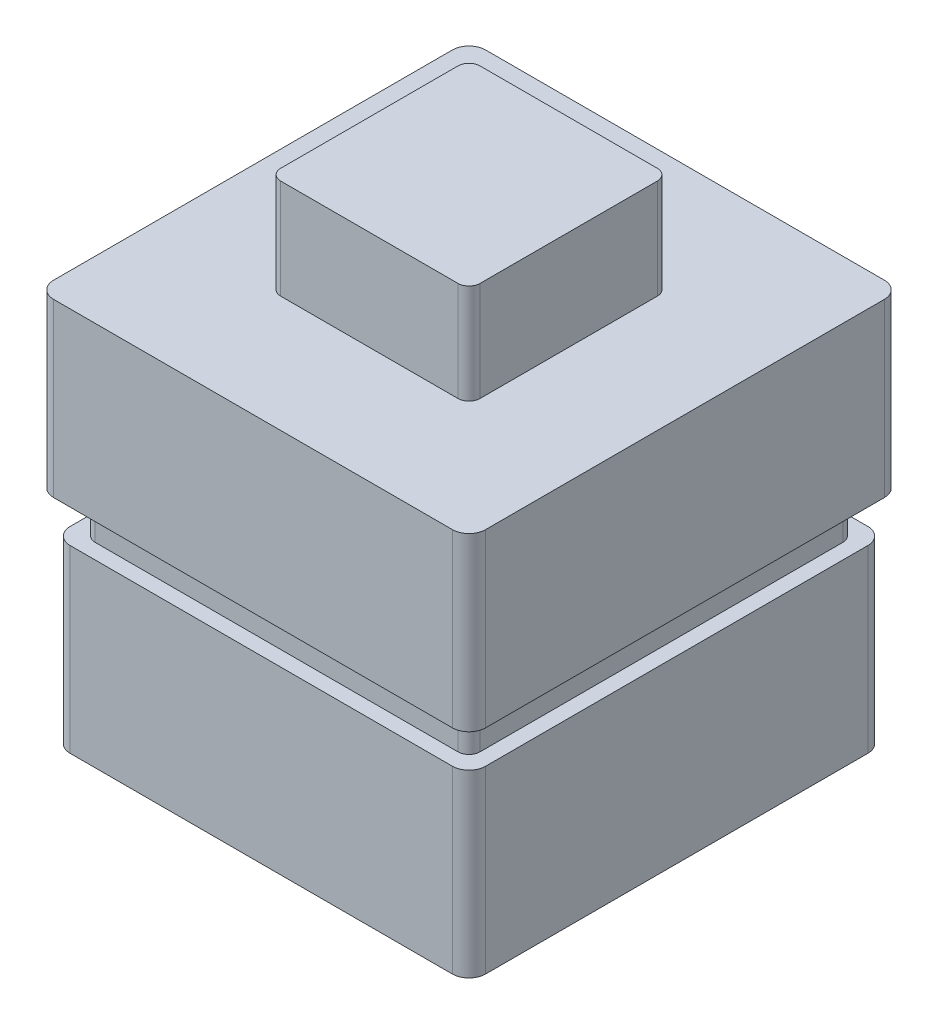
ISO-10303-21;
HEADER;
FILE_DESCRIPTION(('STEP AP214'),'2;1');
FILE_NAME('part.step','',(''),(''),'','','');
FILE_SCHEMA(('AUTOMOTIVE_DESIGN { 1 0 10303 214 1 1 1 1 }'));
ENDSEC;
DATA;
#1=APPLICATION_CONTEXT('core data for automotive mechanical design processes');
#2=APPLICATION_PROTOCOL_DEFINITION('international standard','automotive_design',2000,#1);
#3=PRODUCT_CONTEXT('',#1,'mechanical');
#4=PRODUCT('Part','Part','',(#3));
#5=PRODUCT_RELATED_PRODUCT_CATEGORY('part','',(#4));
#6=PRODUCT_DEFINITION_FORMATION('','',#4);
#7=PRODUCT_DEFINITION_CONTEXT('part definition',#1,'design');
#8=PRODUCT_DEFINITION('design','',#6,#7);
#9=PRODUCT_DEFINITION_SHAPE('','',#8);
#10=(LENGTH_UNIT() NAMED_UNIT(*) SI_UNIT(.MILLI.,.METRE.));
#11=(NAMED_UNIT(*) PLANE_ANGLE_UNIT() SI_UNIT($,.RADIAN.));
#12=(NAMED_UNIT(*) SI_UNIT($,.STERADIAN.) SOLID_ANGLE_UNIT());
#13=UNCERTAINTY_MEASURE_WITH_UNIT(LENGTH_MEASURE(1.E-05),#10,'distance_accuracy_value','');
#14=(GEOMETRIC_REPRESENTATION_CONTEXT(3) GLOBAL_UNCERTAINTY_ASSIGNED_CONTEXT((#13)) GLOBAL_UNIT_ASSIGNED_CONTEXT((#10,
#11,#12)) REPRESENTATION_CONTEXT('',''));
#15=CARTESIAN_POINT('',(0.,0.,0.));
#16=DIRECTION('',(0.,0.,1.));
#17=DIRECTION('',(1.,0.,0.));
#18=AXIS2_PLACEMENT_3D('',#15,#16,#17);
#19=CARTESIAN_POINT('',(-7.2,73.2,-88.7));
#20=DIRECTION('',(0.,-1.,0.));
#21=DIRECTION('',(0.,0.,-1.));
#22=AXIS2_PLACEMENT_3D('',#19,#20,#21);
#23=PLANE('',#22);
#24=CARTESIAN_POINT('',(-7.2,73.2,-88.7));
#25=DIRECTION('',(0.,1.,0.));
#26=DIRECTION('',(0.,0.,-1.));
#27=AXIS2_PLACEMENT_3D('',#24,#25,#26);
#28=CIRCLE('',#27,0.599999999999995);
#29=CARTESIAN_POINT('',(-7.2,73.2,-89.3));
#30=VERTEX_POINT('',#29);
#31=CARTESIAN_POINT('',(-7.8,73.2,-88.7));
#32=VERTEX_POINT('',#31);
#33=EDGE_CURVE('E379',#30,#32,#28,.T.);
#34=ORIENTED_EDGE('',*,*,#33,.T.);
#35=DIRECTION('',(0.,0.,1.));
#36=VECTOR('',#35,1.);
#37=CARTESIAN_POINT('',(-7.8,73.2,-74.3));
#38=LINE('',#37,#36);
#39=CARTESIAN_POINT('',(-7.8,73.2,-74.3));
#40=VERTEX_POINT('',#39);
#41=EDGE_CURVE('E382',#32,#40,#38,.T.);
#42=ORIENTED_EDGE('',*,*,#41,.T.);
#43=CARTESIAN_POINT('',(-7.2,73.2,-74.3));
#44=DIRECTION('',(0.,1.,0.));
#45=DIRECTION('',(0.,0.,-1.));
#46=AXIS2_PLACEMENT_3D('',#43,#44,#45);
#47=CIRCLE('',#46,0.599999999999995);
#48=CARTESIAN_POINT('',(-7.2,73.2,-73.7));
#49=VERTEX_POINT('',#48);
#50=EDGE_CURVE('E387',#40,#49,#47,.T.);
#51=ORIENTED_EDGE('',*,*,#50,.T.);
#52=DIRECTION('',(1.,0.,0.));
#53=VECTOR('',#52,1.);
#54=CARTESIAN_POINT('',(7.2,73.2,-73.7));
#55=LINE('',#54,#53);
#56=CARTESIAN_POINT('',(7.2,73.2,-73.7));
#57=VERTEX_POINT('',#56);
#58=EDGE_CURVE('E389',#49,#57,#55,.T.);
#59=ORIENTED_EDGE('',*,*,#58,.T.);
#60=CARTESIAN_POINT('',(7.2,73.2,-74.3));
#61=DIRECTION('',(0.,1.,0.));
#62=DIRECTION('',(0.,0.,-1.));
#63=AXIS2_PLACEMENT_3D('',#60,#61,#62);
#64=CIRCLE('',#63,0.599999999999995);
#65=CARTESIAN_POINT('',(7.79999999999999,73.2,-74.3));
#66=VERTEX_POINT('',#65);
#67=EDGE_CURVE('E388',#57,#66,#64,.T.);
#68=ORIENTED_EDGE('',*,*,#67,.T.);
#69=DIRECTION('',(0.,0.,-1.));
#70=VECTOR('',#69,1.);
#71=CARTESIAN_POINT('',(7.8,73.2,-88.7));
#72=LINE('',#71,#70);
#73=CARTESIAN_POINT('',(7.8,73.2,-88.7));
#74=VERTEX_POINT('',#73);
#75=EDGE_CURVE('E395',#66,#74,#72,.T.);
#76=ORIENTED_EDGE('',*,*,#75,.T.);
#77=CARTESIAN_POINT('',(7.2,73.2,-88.7));
#78=DIRECTION('',(0.,1.,0.));
#79=DIRECTION('',(0.,0.,-1.));
#80=AXIS2_PLACEMENT_3D('',#77,#78,#79);
#81=CIRCLE('',#80,0.599999999999995);
#82=CARTESIAN_POINT('',(7.2,73.2,-89.3));
#83=VERTEX_POINT('',#82);
#84=EDGE_CURVE('E391',#74,#83,#81,.T.);
#85=ORIENTED_EDGE('',*,*,#84,.T.);
#86=DIRECTION('',(-1.,0.,0.));
#87=VECTOR('',#86,1.);
#88=CARTESIAN_POINT('',(-7.2,73.2,-89.3));
#89=LINE('',#88,#87);
#90=EDGE_CURVE('E398',#83,#30,#89,.T.);
#91=ORIENTED_EDGE('',*,*,#90,.T.);
#92=EDGE_LOOP('',(#34,#42,#51,#59,#68,#76,#85,#91));
#93=FACE_BOUND('',#92,.T.);
#94=CARTESIAN_POINT('',(-3.2,73.2,-84.7));
#95=DIRECTION('',(0.,1.,0.));
#96=DIRECTION('',(0.,0.,-1.));
#97=AXIS2_PLACEMENT_3D('',#94,#95,#96);
#98=CIRCLE('',#97,0.400000000000006);
#99=CARTESIAN_POINT('',(-3.2,73.2,-85.1));
#100=VERTEX_POINT('',#99);
#101=CARTESIAN_POINT('',(-3.6,73.2,-84.7));
#102=VERTEX_POINT('',#101);
#103=EDGE_CURVE('E53',#100,#102,#98,.T.);
#104=ORIENTED_EDGE('',*,*,#103,.F.);
#105=DIRECTION('',(-1.,0.,0.));
#106=VECTOR('',#105,1.);
#107=CARTESIAN_POINT('',(-3.2,73.2,-85.1));
#108=LINE('',#107,#106);
#109=CARTESIAN_POINT('',(3.2,73.2,-85.1));
#110=VERTEX_POINT('',#109);
#111=EDGE_CURVE('E59',#110,#100,#108,.T.);
#112=ORIENTED_EDGE('',*,*,#111,.F.);
#113=CARTESIAN_POINT('',(3.2,73.2,-84.7));
#114=DIRECTION('',(0.,1.,0.));
#115=DIRECTION('',(0.,0.,-1.));
#116=AXIS2_PLACEMENT_3D('',#113,#114,#115);
#117=CIRCLE('',#116,0.400000000000006);
#118=CARTESIAN_POINT('',(3.6,73.2,-84.7));
#119=VERTEX_POINT('',#118);
#120=EDGE_CURVE('E848',#119,#110,#117,.T.);
#121=ORIENTED_EDGE('',*,*,#120,.F.);
#122=DIRECTION('',(0.,0.,-1.));
#123=VECTOR('',#122,1.);
#124=CARTESIAN_POINT('',(3.6,73.2,-84.7));
#125=LINE('',#124,#123);
#126=CARTESIAN_POINT('',(3.6,73.2,-78.3));
#127=VERTEX_POINT('',#126);
#128=EDGE_CURVE('E881',#127,#119,#125,.T.);
#129=ORIENTED_EDGE('',*,*,#128,.F.);
#130=CARTESIAN_POINT('',(3.2,73.2,-78.3));
#131=DIRECTION('',(0.,1.,0.));
#132=DIRECTION('',(0.,0.,-1.));
#133=AXIS2_PLACEMENT_3D('',#130,#131,#132);
#134=CIRCLE('',#133,0.399999999999999);
#135=CARTESIAN_POINT('',(3.2,73.2,-77.9));
#136=VERTEX_POINT('',#135);
#137=EDGE_CURVE('E880',#136,#127,#134,.T.);
#138=ORIENTED_EDGE('',*,*,#137,.F.);
#139=DIRECTION('',(1.,0.,0.));
#140=VECTOR('',#139,1.);
#141=CARTESIAN_POINT('',(3.2,73.2,-77.9));
#142=LINE('',#141,#140);
#143=CARTESIAN_POINT('',(-3.2,73.2,-77.9));
#144=VERTEX_POINT('',#143);
#145=EDGE_CURVE('E871',#144,#136,#142,.T.);
#146=ORIENTED_EDGE('',*,*,#145,.F.);
#147=CARTESIAN_POINT('',(-3.2,73.2,-78.3));
#148=DIRECTION('',(0.,1.,0.));
#149=DIRECTION('',(0.,0.,-1.));
#150=AXIS2_PLACEMENT_3D('',#147,#148,#149);
#151=CIRCLE('',#150,0.399999999999999);
#152=CARTESIAN_POINT('',(-3.6,73.2,-78.3));
#153=VERTEX_POINT('',#152);
#154=EDGE_CURVE('E872',#153,#144,#151,.T.);
#155=ORIENTED_EDGE('',*,*,#154,.F.);
#156=DIRECTION('',(0.,0.,1.));
#157=VECTOR('',#156,1.);
#158=CARTESIAN_POINT('',(-3.6,73.2,-78.3));
#159=LINE('',#158,#157);
#160=EDGE_CURVE('E874',#102,#153,#159,.T.);
#161=ORIENTED_EDGE('',*,*,#160,.F.);
#162=EDGE_LOOP('',(#104,#112,#121,#129,#138,#146,#155,#161));
#163=FACE_BOUND('',#162,.T.);
#164=ADVANCED_FACE('F39',(#93,#163),#23,.F.);
#165=CARTESIAN_POINT('',(-7.2,67.,-88.7));
#166=DIRECTION('',(0.,-1.,0.));
#167=DIRECTION('',(0.,0.,-1.));
#168=AXIS2_PLACEMENT_3D('',#165,#166,#167);
#169=PLANE('',#168);
#170=CARTESIAN_POINT('',(-7.2,67.,-88.7));
#171=DIRECTION('',(0.,1.,0.));
#172=DIRECTION('',(0.,0.,-1.));
#173=AXIS2_PLACEMENT_3D('',#170,#171,#172);
#174=CIRCLE('',#173,0.599999999999995);
#175=CARTESIAN_POINT('',(-7.2,67.,-89.3));
#176=VERTEX_POINT('',#175);
#177=CARTESIAN_POINT('',(-7.8,67.,-88.7));
#178=VERTEX_POINT('',#177);
#179=EDGE_CURVE('E377',#176,#178,#174,.T.);
#180=ORIENTED_EDGE('',*,*,#179,.F.);
#181=DIRECTION('',(-1.,0.,0.));
#182=VECTOR('',#181,1.);
#183=CARTESIAN_POINT('',(-7.2,67.,-89.3));
#184=LINE('',#183,#182);
#185=CARTESIAN_POINT('',(7.2,67.,-89.3));
#186=VERTEX_POINT('',#185);
#187=EDGE_CURVE('E383',#186,#176,#184,.T.);
#188=ORIENTED_EDGE('',*,*,#187,.F.);
#189=CARTESIAN_POINT('',(7.2,67.,-88.7));
#190=DIRECTION('',(0.,1.,0.));
#191=DIRECTION('',(0.,0.,-1.));
#192=AXIS2_PLACEMENT_3D('',#189,#190,#191);
#193=CIRCLE('',#192,0.599999999999995);
#194=CARTESIAN_POINT('',(7.8,67.,-88.7));
#195=VERTEX_POINT('',#194);
#196=EDGE_CURVE('E413',#195,#186,#193,.T.);
#197=ORIENTED_EDGE('',*,*,#196,.F.);
#198=DIRECTION('',(0.,0.,-1.));
#199=VECTOR('',#198,1.);
#200=CARTESIAN_POINT('',(7.8,67.,-88.7));
#201=LINE('',#200,#199);
#202=CARTESIAN_POINT('',(7.79999999999999,67.,-74.3));
#203=VERTEX_POINT('',#202);
#204=EDGE_CURVE('E406',#203,#195,#201,.T.);
#205=ORIENTED_EDGE('',*,*,#204,.F.);
#206=CARTESIAN_POINT('',(7.2,67.,-74.3));
#207=DIRECTION('',(0.,1.,0.));
#208=DIRECTION('',(0.,0.,-1.));
#209=AXIS2_PLACEMENT_3D('',#206,#207,#208);
#210=CIRCLE('',#209,0.599999999999995);
#211=CARTESIAN_POINT('',(7.2,67.,-73.7));
#212=VERTEX_POINT('',#211);
#213=EDGE_CURVE('E410',#212,#203,#210,.T.);
#214=ORIENTED_EDGE('',*,*,#213,.F.);
#215=DIRECTION('',(1.,0.,0.));
#216=VECTOR('',#215,1.);
#217=CARTESIAN_POINT('',(7.2,67.,-73.7));
#218=LINE('',#217,#216);
#219=CARTESIAN_POINT('',(-7.2,67.,-73.7));
#220=VERTEX_POINT('',#219);
#221=EDGE_CURVE('E403',#220,#212,#218,.T.);
#222=ORIENTED_EDGE('',*,*,#221,.F.);
#223=CARTESIAN_POINT('',(-7.2,67.,-74.3));
#224=DIRECTION('',(0.,1.,0.));
#225=DIRECTION('',(0.,0.,-1.));
#226=AXIS2_PLACEMENT_3D('',#223,#224,#225);
#227=CIRCLE('',#226,0.599999999999995);
#228=CARTESIAN_POINT('',(-7.8,67.,-74.3));
#229=VERTEX_POINT('',#228);
#230=EDGE_CURVE('E401',#229,#220,#227,.T.);
#231=ORIENTED_EDGE('',*,*,#230,.F.);
#232=DIRECTION('',(0.,0.,1.));
#233=VECTOR('',#232,1.);
#234=CARTESIAN_POINT('',(-7.8,67.,-74.3));
#235=LINE('',#234,#233);
#236=EDGE_CURVE('E402',#178,#229,#235,.T.);
#237=ORIENTED_EDGE('',*,*,#236,.F.);
#238=EDGE_LOOP('',(#180,#188,#197,#205,#214,#222,#231,#237));
#239=FACE_BOUND('',#238,.T.);
#240=DIRECTION('',(-1.,0.,0.));
#241=VECTOR('',#240,1.);
#242=CARTESIAN_POINT('',(-7.2,67.,-88.45));
#243=LINE('',#242,#241);
#244=CARTESIAN_POINT('',(6.55,67.,-88.45));
#245=VERTEX_POINT('',#244);
#246=CARTESIAN_POINT('',(-6.55,67.,-88.45));
#247=VERTEX_POINT('',#246);
#248=EDGE_CURVE('E440',#245,#247,#243,.T.);
#249=ORIENTED_EDGE('',*,*,#248,.T.);
#250=CARTESIAN_POINT('',(-6.55,67.,-88.05));
#251=DIRECTION('',(0.,-1.,0.));
#252=DIRECTION('',(0.,0.,-1.));
#253=AXIS2_PLACEMENT_3D('',#250,#251,#252);
#254=CIRCLE('',#253,0.399999999999999);
#255=CARTESIAN_POINT('',(-6.95,67.,-88.05));
#256=VERTEX_POINT('',#255);
#257=EDGE_CURVE('E11',#247,#256,#254,.F.);
#258=ORIENTED_EDGE('',*,*,#257,.T.);
#259=DIRECTION('',(0.,0.,1.));
#260=VECTOR('',#259,1.);
#261=CARTESIAN_POINT('',(-6.95,67.,-88.7));
#262=LINE('',#261,#260);
#263=CARTESIAN_POINT('',(-6.95,67.,-74.95));
#264=VERTEX_POINT('',#263);
#265=EDGE_CURVE('E50',#256,#264,#262,.T.);
#266=ORIENTED_EDGE('',*,*,#265,.T.);
#267=CARTESIAN_POINT('',(-6.55,67.,-74.95));
#268=DIRECTION('',(0.,-1.,0.));
#269=DIRECTION('',(0.,0.,-1.));
#270=AXIS2_PLACEMENT_3D('',#267,#268,#269);
#271=CIRCLE('',#270,0.400000000000006);
#272=CARTESIAN_POINT('',(-6.55,67.,-74.55));
#273=VERTEX_POINT('',#272);
#274=EDGE_CURVE('E454',#264,#273,#271,.F.);
#275=ORIENTED_EDGE('',*,*,#274,.T.);
#276=DIRECTION('',(1.,0.,0.));
#277=VECTOR('',#276,1.);
#278=CARTESIAN_POINT('',(-7.2,67.,-74.55));
#279=LINE('',#278,#277);
#280=CARTESIAN_POINT('',(6.55,67.,-74.55));
#281=VERTEX_POINT('',#280);
#282=EDGE_CURVE('E446',#273,#281,#279,.T.);
#283=ORIENTED_EDGE('',*,*,#282,.T.);
#284=CARTESIAN_POINT('',(6.55,67.,-74.95));
#285=DIRECTION('',(0.,-1.,0.));
#286=DIRECTION('',(0.,0.,-1.));
#287=AXIS2_PLACEMENT_3D('',#284,#285,#286);
#288=CIRCLE('',#287,0.400000000000006);
#289=CARTESIAN_POINT('',(6.95000000000001,67.,-74.95));
#290=VERTEX_POINT('',#289);
#291=EDGE_CURVE('E447',#281,#290,#288,.F.);
#292=ORIENTED_EDGE('',*,*,#291,.T.);
#293=DIRECTION('',(0.,0.,-1.));
#294=VECTOR('',#293,1.);
#295=CARTESIAN_POINT('',(6.95,67.,-88.7));
#296=LINE('',#295,#294);
#297=CARTESIAN_POINT('',(6.95,67.,-88.05));
#298=VERTEX_POINT('',#297);
#299=EDGE_CURVE('E444',#290,#298,#296,.T.);
#300=ORIENTED_EDGE('',*,*,#299,.T.);
#301=CARTESIAN_POINT('',(6.55,67.,-88.05));
#302=DIRECTION('',(0.,-1.,0.));
#303=DIRECTION('',(0.,0.,-1.));
#304=AXIS2_PLACEMENT_3D('',#301,#302,#303);
#305=CIRCLE('',#304,0.399999999999999);
#306=EDGE_CURVE('E439',#298,#245,#305,.F.);
#307=ORIENTED_EDGE('',*,*,#306,.T.);
#308=EDGE_LOOP('',(#249,#258,#266,#275,#283,#292,#300,#307));
#309=FACE_BOUND('',#308,.T.);
#310=ADVANCED_FACE('F457',(#239,#309),#169,.T.);
#311=CARTESIAN_POINT('',(-7.2,73.2,-88.7));
#312=DIRECTION('',(0.,-1.,0.));
#313=DIRECTION('',(0.,0.,-1.));
#314=AXIS2_PLACEMENT_3D('',#311,#312,#313);
#315=CYLINDRICAL_SURFACE('',#314,0.599999999999995);
#316=ORIENTED_EDGE('',*,*,#179,.T.);
#317=DIRECTION('',(0.,-1.,0.));
#318=VECTOR('',#317,1.);
#319=CARTESIAN_POINT('',(-7.8,73.2,-88.7));
#320=LINE('',#319,#318);
#321=EDGE_CURVE('E432',#32,#178,#320,.T.);
#322=ORIENTED_EDGE('',*,*,#321,.F.);
#323=ORIENTED_EDGE('',*,*,#33,.F.);
#324=DIRECTION('',(0.,-1.,0.));
#325=VECTOR('',#324,1.);
#326=CARTESIAN_POINT('',(-7.2,73.2,-89.3));
#327=LINE('',#326,#325);
#328=EDGE_CURVE('E397',#30,#176,#327,.T.);
#329=ORIENTED_EDGE('',*,*,#328,.T.);
#330=EDGE_LOOP('',(#316,#322,#323,#329));
#331=FACE_BOUND('',#330,.T.);
#332=ADVANCED_FACE('F41',(#331),#315,.T.);
#333=CARTESIAN_POINT('',(-7.8,73.2,-74.3));
#334=DIRECTION('',(1.,0.,0.));
#335=DIRECTION('',(0.,0.,-1.));
#336=AXIS2_PLACEMENT_3D('',#333,#334,#335);
#337=PLANE('',#336);
#338=ORIENTED_EDGE('',*,*,#236,.T.);
#339=DIRECTION('',(0.,-1.,0.));
#340=VECTOR('',#339,1.);
#341=CARTESIAN_POINT('',(-7.8,73.2,-74.3));
#342=LINE('',#341,#340);
#343=EDGE_CURVE('E431',#40,#229,#342,.T.);
#344=ORIENTED_EDGE('',*,*,#343,.F.);
#345=ORIENTED_EDGE('',*,*,#41,.F.);
#346=ORIENTED_EDGE('',*,*,#321,.T.);
#347=EDGE_LOOP('',(#338,#344,#345,#346));
#348=FACE_BOUND('',#347,.T.);
#349=ADVANCED_FACE('F529',(#348),#337,.F.);
#350=CARTESIAN_POINT('',(-7.2,73.2,-74.3));
#351=DIRECTION('',(0.,-1.,0.));
#352=DIRECTION('',(0.,0.,-1.));
#353=AXIS2_PLACEMENT_3D('',#350,#351,#352);
#354=CYLINDRICAL_SURFACE('',#353,0.599999999999995);
#355=ORIENTED_EDGE('',*,*,#230,.T.);
#356=DIRECTION('',(0.,-1.,0.));
#357=VECTOR('',#356,1.);
#358=CARTESIAN_POINT('',(-7.2,73.2,-73.7));
#359=LINE('',#358,#357);
#360=EDGE_CURVE('E428',#49,#220,#359,.T.);
#361=ORIENTED_EDGE('',*,*,#360,.F.);
#362=ORIENTED_EDGE('',*,*,#50,.F.);
#363=ORIENTED_EDGE('',*,*,#343,.T.);
#364=EDGE_LOOP('',(#355,#361,#362,#363));
#365=FACE_BOUND('',#364,.T.);
#366=ADVANCED_FACE('F527',(#365),#354,.T.);
#367=CARTESIAN_POINT('',(7.2,73.2,-73.7));
#368=DIRECTION('',(0.,0.,-1.));
#369=DIRECTION('',(-1.,0.,0.));
#370=AXIS2_PLACEMENT_3D('',#367,#368,#369);
#371=PLANE('',#370);
#372=ORIENTED_EDGE('',*,*,#221,.T.);
#373=DIRECTION('',(0.,-1.,0.));
#374=VECTOR('',#373,1.);
#375=CARTESIAN_POINT('',(7.2,73.2,-73.7));
#376=LINE('',#375,#374);
#377=EDGE_CURVE('E422',#57,#212,#376,.T.);
#378=ORIENTED_EDGE('',*,*,#377,.F.);
#379=ORIENTED_EDGE('',*,*,#58,.F.);
#380=ORIENTED_EDGE('',*,*,#360,.T.);
#381=EDGE_LOOP('',(#372,#378,#379,#380));
#382=FACE_BOUND('',#381,.T.);
#383=ADVANCED_FACE('F522',(#382),#371,.F.);
#384=CARTESIAN_POINT('',(7.2,73.2,-74.3));
#385=DIRECTION('',(0.,-1.,0.));
#386=DIRECTION('',(0.,0.,-1.));
#387=AXIS2_PLACEMENT_3D('',#384,#385,#386);
#388=CYLINDRICAL_SURFACE('',#387,0.599999999999995);
#389=ORIENTED_EDGE('',*,*,#213,.T.);
#390=DIRECTION('',(0.,-1.,0.));
#391=VECTOR('',#390,1.);
#392=CARTESIAN_POINT('',(7.79999999999999,73.2,-74.3));
#393=LINE('',#392,#391);
#394=EDGE_CURVE('E425',#66,#203,#393,.T.);
#395=ORIENTED_EDGE('',*,*,#394,.F.);
#396=ORIENTED_EDGE('',*,*,#67,.F.);
#397=ORIENTED_EDGE('',*,*,#377,.T.);
#398=EDGE_LOOP('',(#389,#395,#396,#397));
#399=FACE_BOUND('',#398,.T.);
#400=ADVANCED_FACE('F516',(#399),#388,.T.);
#401=CARTESIAN_POINT('',(7.8,73.2,-88.7));
#402=DIRECTION('',(-1.,0.,0.));
#403=DIRECTION('',(0.,0.,1.));
#404=AXIS2_PLACEMENT_3D('',#401,#402,#403);
#405=PLANE('',#404);
#406=ORIENTED_EDGE('',*,*,#204,.T.);
#407=DIRECTION('',(0.,-1.,0.));
#408=VECTOR('',#407,1.);
#409=CARTESIAN_POINT('',(7.8,73.2,-88.7));
#410=LINE('',#409,#408);
#411=EDGE_CURVE('E420',#74,#195,#410,.T.);
#412=ORIENTED_EDGE('',*,*,#411,.F.);
#413=ORIENTED_EDGE('',*,*,#75,.F.);
#414=ORIENTED_EDGE('',*,*,#394,.T.);
#415=EDGE_LOOP('',(#406,#412,#413,#414));
#416=FACE_BOUND('',#415,.T.);
#417=ADVANCED_FACE('F513',(#416),#405,.F.);
#418=CARTESIAN_POINT('',(7.2,73.2,-88.7));
#419=DIRECTION('',(0.,-1.,0.));
#420=DIRECTION('',(0.,0.,-1.));
#421=AXIS2_PLACEMENT_3D('',#418,#419,#420);
#422=CYLINDRICAL_SURFACE('',#421,0.599999999999995);
#423=ORIENTED_EDGE('',*,*,#196,.T.);
#424=DIRECTION('',(0.,-1.,0.));
#425=VECTOR('',#424,1.);
#426=CARTESIAN_POINT('',(7.2,73.2,-89.3));
#427=LINE('',#426,#425);
#428=EDGE_CURVE('E418',#83,#186,#427,.T.);
#429=ORIENTED_EDGE('',*,*,#428,.F.);
#430=ORIENTED_EDGE('',*,*,#84,.F.);
#431=ORIENTED_EDGE('',*,*,#411,.T.);
#432=EDGE_LOOP('',(#423,#429,#430,#431));
#433=FACE_BOUND('',#432,.T.);
#434=ADVANCED_FACE('F512',(#433),#422,.T.);
#435=CARTESIAN_POINT('',(-7.2,73.2,-89.3));
#436=DIRECTION('',(0.,0.,1.));
#437=DIRECTION('',(1.,0.,0.));
#438=AXIS2_PLACEMENT_3D('',#435,#436,#437);
#439=PLANE('',#438);
#440=ORIENTED_EDGE('',*,*,#187,.T.);
#441=ORIENTED_EDGE('',*,*,#328,.F.);
#442=ORIENTED_EDGE('',*,*,#90,.F.);
#443=ORIENTED_EDGE('',*,*,#428,.T.);
#444=EDGE_LOOP('',(#440,#441,#442,#443));
#445=FACE_BOUND('',#444,.T.);
#446=ADVANCED_FACE('F507',(#445),#439,.F.);
#447=CARTESIAN_POINT('',(-6.55,67.2,-88.05));
#448=DIRECTION('',(0.,-1.,0.));
#449=DIRECTION('',(0.,0.,-1.));
#450=AXIS2_PLACEMENT_3D('',#447,#448,#449);
#451=CYLINDRICAL_SURFACE('',#450,0.399999999999999);
#452=ORIENTED_EDGE('',*,*,#257,.F.);
#453=DIRECTION('',(0.,-1.,0.));
#454=VECTOR('',#453,1.);
#455=CARTESIAN_POINT('',(-6.55,67.2,-88.45));
#456=LINE('',#455,#454);
#457=CARTESIAN_POINT('',(-6.55,65.5,-88.45));
#458=VERTEX_POINT('',#457);
#459=EDGE_CURVE('E353',#247,#458,#456,.T.);
#460=ORIENTED_EDGE('',*,*,#459,.T.);
#461=CARTESIAN_POINT('',(-6.55,65.5,-88.05));
#462=DIRECTION('',(0.,1.,0.));
#463=DIRECTION('',(0.,0.,-1.));
#464=AXIS2_PLACEMENT_3D('',#461,#462,#463);
#465=CIRCLE('',#464,0.399999999999999);
#466=CARTESIAN_POINT('',(-6.95,65.5,-88.05));
#467=VERTEX_POINT('',#466);
#468=EDGE_CURVE('E332',#458,#467,#465,.T.);
#469=ORIENTED_EDGE('',*,*,#468,.T.);
#470=DIRECTION('',(0.,-1.,0.));
#471=VECTOR('',#470,1.);
#472=CARTESIAN_POINT('',(-6.95,67.2,-88.05));
#473=LINE('',#472,#471);
#474=EDGE_CURVE('E376',#256,#467,#473,.T.);
#475=ORIENTED_EDGE('',*,*,#474,.F.);
#476=EDGE_LOOP('',(#452,#460,#469,#475));
#477=FACE_BOUND('',#476,.T.);
#478=ADVANCED_FACE('F464',(#477),#451,.T.);
#479=CARTESIAN_POINT('',(-6.95,67.2,-74.95));
#480=DIRECTION('',(1.,0.,0.));
#481=DIRECTION('',(0.,0.,-1.));
#482=AXIS2_PLACEMENT_3D('',#479,#480,#481);
#483=PLANE('',#482);
#484=ORIENTED_EDGE('',*,*,#265,.F.);
#485=ORIENTED_EDGE('',*,*,#474,.T.);
#486=DIRECTION('',(0.,0.,1.));
#487=VECTOR('',#486,1.);
#488=CARTESIAN_POINT('',(-6.95,65.5,-74.95));
#489=LINE('',#488,#487);
#490=CARTESIAN_POINT('',(-6.95,65.5,-74.95));
#491=VERTEX_POINT('',#490);
#492=EDGE_CURVE('E331',#467,#491,#489,.T.);
#493=ORIENTED_EDGE('',*,*,#492,.T.);
#494=DIRECTION('',(0.,-1.,0.));
#495=VECTOR('',#494,1.);
#496=CARTESIAN_POINT('',(-6.95,67.2,-74.95));
#497=LINE('',#496,#495);
#498=EDGE_CURVE('E373',#264,#491,#497,.T.);
#499=ORIENTED_EDGE('',*,*,#498,.F.);
#500=EDGE_LOOP('',(#484,#485,#493,#499));
#501=FACE_BOUND('',#500,.T.);
#502=ADVANCED_FACE('F462',(#501),#483,.F.);
#503=CARTESIAN_POINT('',(-6.55,67.2,-74.95));
#504=DIRECTION('',(0.,-1.,0.));
#505=DIRECTION('',(0.,0.,-1.));
#506=AXIS2_PLACEMENT_3D('',#503,#504,#505);
#507=CYLINDRICAL_SURFACE('',#506,0.400000000000006);
#508=ORIENTED_EDGE('',*,*,#274,.F.);
#509=ORIENTED_EDGE('',*,*,#498,.T.);
#510=CARTESIAN_POINT('',(-6.55,65.5,-74.95));
#511=DIRECTION('',(0.,1.,0.));
#512=DIRECTION('',(0.,0.,-1.));
#513=AXIS2_PLACEMENT_3D('',#510,#511,#512);
#514=CIRCLE('',#513,0.400000000000006);
#515=CARTESIAN_POINT('',(-6.55,65.5,-74.55));
#516=VERTEX_POINT('',#515);
#517=EDGE_CURVE('E340',#491,#516,#514,.T.);
#518=ORIENTED_EDGE('',*,*,#517,.T.);
#519=DIRECTION('',(0.,-1.,0.));
#520=VECTOR('',#519,1.);
#521=CARTESIAN_POINT('',(-6.55,67.2,-74.55));
#522=LINE('',#521,#520);
#523=EDGE_CURVE('E367',#273,#516,#522,.T.);
#524=ORIENTED_EDGE('',*,*,#523,.F.);
#525=EDGE_LOOP('',(#508,#509,#518,#524));
#526=FACE_BOUND('',#525,.T.);
#527=ADVANCED_FACE('F470',(#526),#507,.T.);
#528=CARTESIAN_POINT('',(6.55,67.2,-74.55));
#529=DIRECTION('',(0.,0.,-1.));
#530=DIRECTION('',(-1.,0.,0.));
#531=AXIS2_PLACEMENT_3D('',#528,#529,#530);
#532=PLANE('',#531);
#533=ORIENTED_EDGE('',*,*,#282,.F.);
#534=ORIENTED_EDGE('',*,*,#523,.T.);
#535=DIRECTION('',(1.,0.,0.));
#536=VECTOR('',#535,1.);
#537=CARTESIAN_POINT('',(6.55,65.5,-74.55));
#538=LINE('',#537,#536);
#539=CARTESIAN_POINT('',(6.55,65.5,-74.55));
#540=VERTEX_POINT('',#539);
#541=EDGE_CURVE('E338',#516,#540,#538,.T.);
#542=ORIENTED_EDGE('',*,*,#541,.T.);
#543=DIRECTION('',(0.,-1.,0.));
#544=VECTOR('',#543,1.);
#545=CARTESIAN_POINT('',(6.55,67.2,-74.55));
#546=LINE('',#545,#544);
#547=EDGE_CURVE('E370',#281,#540,#546,.T.);
#548=ORIENTED_EDGE('',*,*,#547,.F.);
#549=EDGE_LOOP('',(#533,#534,#542,#548));
#550=FACE_BOUND('',#549,.T.);
#551=ADVANCED_FACE('F473',(#550),#532,.F.);
#552=CARTESIAN_POINT('',(6.55,67.2,-74.95));
#553=DIRECTION('',(0.,-1.,0.));
#554=DIRECTION('',(0.,0.,-1.));
#555=AXIS2_PLACEMENT_3D('',#552,#553,#554);
#556=CYLINDRICAL_SURFACE('',#555,0.400000000000006);
#557=ORIENTED_EDGE('',*,*,#291,.F.);
#558=ORIENTED_EDGE('',*,*,#547,.T.);
#559=CARTESIAN_POINT('',(6.55,65.5,-74.95));
#560=DIRECTION('',(0.,1.,0.));
#561=DIRECTION('',(0.,0.,-1.));
#562=AXIS2_PLACEMENT_3D('',#559,#560,#561);
#563=CIRCLE('',#562,0.400000000000006);
#564=CARTESIAN_POINT('',(6.95000000000001,65.5,-74.95));
#565=VERTEX_POINT('',#564);
#566=EDGE_CURVE('E342',#540,#565,#563,.T.);
#567=ORIENTED_EDGE('',*,*,#566,.T.);
#568=DIRECTION('',(0.,-1.,0.));
#569=VECTOR('',#568,1.);
#570=CARTESIAN_POINT('',(6.95000000000001,67.2,-74.95));
#571=LINE('',#570,#569);
#572=EDGE_CURVE('E365',#290,#565,#571,.T.);
#573=ORIENTED_EDGE('',*,*,#572,.F.);
#574=EDGE_LOOP('',(#557,#558,#567,#573));
#575=FACE_BOUND('',#574,.T.);
#576=ADVANCED_FACE('F474',(#575),#556,.T.);
#577=CARTESIAN_POINT('',(6.95,67.2,-88.05));
#578=DIRECTION('',(-1.,0.,0.));
#579=DIRECTION('',(0.,0.,1.));
#580=AXIS2_PLACEMENT_3D('',#577,#578,#579);
#581=PLANE('',#580);
#582=ORIENTED_EDGE('',*,*,#299,.F.);
#583=ORIENTED_EDGE('',*,*,#572,.T.);
#584=DIRECTION('',(0.,0.,-1.));
#585=VECTOR('',#584,1.);
#586=CARTESIAN_POINT('',(6.95,65.5,-88.05));
#587=LINE('',#586,#585);
#588=CARTESIAN_POINT('',(6.95,65.5,-88.05));
#589=VERTEX_POINT('',#588);
#590=EDGE_CURVE('E347',#565,#589,#587,.T.);
#591=ORIENTED_EDGE('',*,*,#590,.T.);
#592=DIRECTION('',(0.,-1.,0.));
#593=VECTOR('',#592,1.);
#594=CARTESIAN_POINT('',(6.95,67.2,-88.05));
#595=LINE('',#594,#593);
#596=EDGE_CURVE('E363',#298,#589,#595,.T.);
#597=ORIENTED_EDGE('',*,*,#596,.F.);
#598=EDGE_LOOP('',(#582,#583,#591,#597));
#599=FACE_BOUND('',#598,.T.);
#600=ADVANCED_FACE('F480',(#599),#581,.F.);
#601=CARTESIAN_POINT('',(6.55,67.2,-88.05));
#602=DIRECTION('',(0.,-1.,0.));
#603=DIRECTION('',(0.,0.,-1.));
#604=AXIS2_PLACEMENT_3D('',#601,#602,#603);
#605=CYLINDRICAL_SURFACE('',#604,0.399999999999999);
#606=ORIENTED_EDGE('',*,*,#306,.F.);
#607=ORIENTED_EDGE('',*,*,#596,.T.);
#608=CARTESIAN_POINT('',(6.55,65.5,-88.05));
#609=DIRECTION('',(0.,1.,0.));
#610=DIRECTION('',(0.,0.,-1.));
#611=AXIS2_PLACEMENT_3D('',#608,#609,#610);
#612=CIRCLE('',#611,0.399999999999999);
#613=CARTESIAN_POINT('',(6.55,65.5,-88.45));
#614=VERTEX_POINT('',#613);
#615=EDGE_CURVE('E349',#589,#614,#612,.T.);
#616=ORIENTED_EDGE('',*,*,#615,.T.);
#617=DIRECTION('',(0.,-1.,0.));
#618=VECTOR('',#617,1.);
#619=CARTESIAN_POINT('',(6.55,67.2,-88.45));
#620=LINE('',#619,#618);
#621=EDGE_CURVE('E357',#245,#614,#620,.T.);
#622=ORIENTED_EDGE('',*,*,#621,.F.);
#623=EDGE_LOOP('',(#606,#607,#616,#622));
#624=FACE_BOUND('',#623,.T.);
#625=ADVANCED_FACE('F477',(#624),#605,.T.);
#626=CARTESIAN_POINT('',(-6.55,67.2,-88.45));
#627=DIRECTION('',(0.,0.,1.));
#628=DIRECTION('',(1.,0.,0.));
#629=AXIS2_PLACEMENT_3D('',#626,#627,#628);
#630=PLANE('',#629);
#631=ORIENTED_EDGE('',*,*,#248,.F.);
#632=ORIENTED_EDGE('',*,*,#621,.T.);
#633=DIRECTION('',(-1.,0.,0.));
#634=VECTOR('',#633,1.);
#635=CARTESIAN_POINT('',(-6.55,65.5,-88.45));
#636=LINE('',#635,#634);
#637=EDGE_CURVE('E355',#614,#458,#636,.T.);
#638=ORIENTED_EDGE('',*,*,#637,.T.);
#639=ORIENTED_EDGE('',*,*,#459,.F.);
#640=EDGE_LOOP('',(#631,#632,#638,#639));
#641=FACE_BOUND('',#640,.T.);
#642=ADVANCED_FACE('F483',(#641),#630,.F.);
#643=CARTESIAN_POINT('',(-6.9,65.5,-88.4));
#644=DIRECTION('',(0.,-1.,0.));
#645=DIRECTION('',(0.,0.,-1.));
#646=AXIS2_PLACEMENT_3D('',#643,#644,#645);
#647=CYLINDRICAL_SURFACE('',#646,0.599999999999994);
#648=CARTESIAN_POINT('',(-6.9,59.,-88.4));
#649=DIRECTION('',(0.,1.,0.));
#650=DIRECTION('',(0.,0.,-1.));
#651=AXIS2_PLACEMENT_3D('',#648,#649,#650);
#652=CIRCLE('',#651,0.599999999999994);
#653=CARTESIAN_POINT('',(-6.9,59.,-89.));
#654=VERTEX_POINT('',#653);
#655=CARTESIAN_POINT('',(-7.5,59.,-88.4));
#656=VERTEX_POINT('',#655);
#657=EDGE_CURVE('E268',#654,#656,#652,.T.);
#658=ORIENTED_EDGE('',*,*,#657,.T.);
#659=DIRECTION('',(0.,-1.,0.));
#660=VECTOR('',#659,1.);
#661=CARTESIAN_POINT('',(-7.5,65.5,-88.4));
#662=LINE('',#661,#660);
#663=CARTESIAN_POINT('',(-7.5,65.5,-88.4));
#664=VERTEX_POINT('',#663);
#665=EDGE_CURVE('E327',#664,#656,#662,.T.);
#666=ORIENTED_EDGE('',*,*,#665,.F.);
#667=CARTESIAN_POINT('',(-6.9,65.5,-88.4));
#668=DIRECTION('',(0.,1.,0.));
#669=DIRECTION('',(0.,0.,-1.));
#670=AXIS2_PLACEMENT_3D('',#667,#668,#669);
#671=CIRCLE('',#670,0.599999999999994);
#672=CARTESIAN_POINT('',(-6.9,65.5,-89.));
#673=VERTEX_POINT('',#672);
#674=EDGE_CURVE('E280',#673,#664,#671,.T.);
#675=ORIENTED_EDGE('',*,*,#674,.F.);
#676=DIRECTION('',(0.,-1.,0.));
#677=VECTOR('',#676,1.);
#678=CARTESIAN_POINT('',(-6.9,65.5,-89.));
#679=LINE('',#678,#677);
#680=EDGE_CURVE('E294',#673,#654,#679,.T.);
#681=ORIENTED_EDGE('',*,*,#680,.T.);
#682=EDGE_LOOP('',(#658,#666,#675,#681));
#683=FACE_BOUND('',#682,.T.);
#684=ADVANCED_FACE('F484',(#683),#647,.T.);
#685=CARTESIAN_POINT('',(-7.5,65.5,-74.6));
#686=DIRECTION('',(1.,0.,0.));
#687=DIRECTION('',(0.,0.,-1.));
#688=AXIS2_PLACEMENT_3D('',#685,#686,#687);
#689=PLANE('',#688);
#690=DIRECTION('',(0.,0.,1.));
#691=VECTOR('',#690,1.);
#692=CARTESIAN_POINT('',(-7.5,59.,-74.6));
#693=LINE('',#692,#691);
#694=CARTESIAN_POINT('',(-7.5,59.,-74.6));
#695=VERTEX_POINT('',#694);
#696=EDGE_CURVE('E271',#656,#695,#693,.T.);
#697=ORIENTED_EDGE('',*,*,#696,.T.);
#698=DIRECTION('',(0.,-1.,0.));
#699=VECTOR('',#698,1.);
#700=CARTESIAN_POINT('',(-7.5,65.5,-74.6));
#701=LINE('',#700,#699);
#702=CARTESIAN_POINT('',(-7.5,65.5,-74.6));
#703=VERTEX_POINT('',#702);
#704=EDGE_CURVE('E324',#703,#695,#701,.T.);
#705=ORIENTED_EDGE('',*,*,#704,.F.);
#706=DIRECTION('',(0.,0.,1.));
#707=VECTOR('',#706,1.);
#708=CARTESIAN_POINT('',(-7.5,65.5,-74.6));
#709=LINE('',#708,#707);
#710=EDGE_CURVE('E278',#664,#703,#709,.T.);
#711=ORIENTED_EDGE('',*,*,#710,.F.);
#712=ORIENTED_EDGE('',*,*,#665,.T.);
#713=EDGE_LOOP('',(#697,#705,#711,#712));
#714=FACE_BOUND('',#713,.T.);
#715=ADVANCED_FACE('F491',(#714),#689,.F.);
#716=CARTESIAN_POINT('',(-6.9,65.5,-74.6));
#717=DIRECTION('',(0.,-1.,0.));
#718=DIRECTION('',(0.,0.,-1.));
#719=AXIS2_PLACEMENT_3D('',#716,#717,#718);
#720=CYLINDRICAL_SURFACE('',#719,0.600000000000001);
#721=CARTESIAN_POINT('',(-6.9,59.,-74.6));
#722=DIRECTION('',(0.,1.,0.));
#723=DIRECTION('',(0.,0.,-1.));
#724=AXIS2_PLACEMENT_3D('',#721,#722,#723);
#725=CIRCLE('',#724,0.600000000000001);
#726=CARTESIAN_POINT('',(-6.9,59.,-74.));
#727=VERTEX_POINT('',#726);
#728=EDGE_CURVE('E300',#695,#727,#725,.T.);
#729=ORIENTED_EDGE('',*,*,#728,.T.);
#730=DIRECTION('',(0.,-1.,0.));
#731=VECTOR('',#730,1.);
#732=CARTESIAN_POINT('',(-6.9,65.5,-74.));
#733=LINE('',#732,#731);
#734=CARTESIAN_POINT('',(-6.9,65.5,-74.));
#735=VERTEX_POINT('',#734);
#736=EDGE_CURVE('E325',#735,#727,#733,.T.);
#737=ORIENTED_EDGE('',*,*,#736,.F.);
#738=CARTESIAN_POINT('',(-6.9,65.5,-74.6));
#739=DIRECTION('',(0.,1.,0.));
#740=DIRECTION('',(0.,0.,-1.));
#741=AXIS2_PLACEMENT_3D('',#738,#739,#740);
#742=CIRCLE('',#741,0.600000000000001);
#743=EDGE_CURVE('E284',#703,#735,#742,.T.);
#744=ORIENTED_EDGE('',*,*,#743,.F.);
#745=ORIENTED_EDGE('',*,*,#704,.T.);
#746=EDGE_LOOP('',(#729,#737,#744,#745));
#747=FACE_BOUND('',#746,.T.);
#748=ADVANCED_FACE('F679',(#747),#720,.T.);
#749=CARTESIAN_POINT('',(6.9,65.5,-74.));
#750=DIRECTION('',(0.,0.,-1.));
#751=DIRECTION('',(-1.,0.,0.));
#752=AXIS2_PLACEMENT_3D('',#749,#750,#751);
#753=PLANE('',#752);
#754=DIRECTION('',(1.,0.,0.));
#755=VECTOR('',#754,1.);
#756=CARTESIAN_POINT('',(6.9,59.,-74.));
#757=LINE('',#756,#755);
#758=CARTESIAN_POINT('',(6.9,59.,-74.));
#759=VERTEX_POINT('',#758);
#760=EDGE_CURVE('E296',#727,#759,#757,.T.);
#761=ORIENTED_EDGE('',*,*,#760,.T.);
#762=DIRECTION('',(0.,-1.,0.));
#763=VECTOR('',#762,1.);
#764=CARTESIAN_POINT('',(6.9,65.5,-74.));
#765=LINE('',#764,#763);
#766=CARTESIAN_POINT('',(6.9,65.5,-74.));
#767=VERTEX_POINT('',#766);
#768=EDGE_CURVE('E317',#767,#759,#765,.T.);
#769=ORIENTED_EDGE('',*,*,#768,.F.);
#770=DIRECTION('',(1.,0.,0.));
#771=VECTOR('',#770,1.);
#772=CARTESIAN_POINT('',(6.9,65.5,-74.));
#773=LINE('',#772,#771);
#774=EDGE_CURVE('E283',#735,#767,#773,.T.);
#775=ORIENTED_EDGE('',*,*,#774,.F.);
#776=ORIENTED_EDGE('',*,*,#736,.T.);
#777=EDGE_LOOP('',(#761,#769,#775,#776));
#778=FACE_BOUND('',#777,.T.);
#779=ADVANCED_FACE('F690',(#778),#753,.F.);
#780=CARTESIAN_POINT('',(6.9,65.5,-74.6));
#781=DIRECTION('',(0.,-1.,0.));
#782=DIRECTION('',(0.,0.,-1.));
#783=AXIS2_PLACEMENT_3D('',#780,#781,#782);
#784=CYLINDRICAL_SURFACE('',#783,0.600000000000001);
#785=CARTESIAN_POINT('',(6.9,59.,-74.6));
#786=DIRECTION('',(0.,1.,0.));
#787=DIRECTION('',(0.,0.,-1.));
#788=AXIS2_PLACEMENT_3D('',#785,#786,#787);
#789=CIRCLE('',#788,0.600000000000001);
#790=CARTESIAN_POINT('',(7.5,59.,-74.6));
#791=VERTEX_POINT('',#790);
#792=EDGE_CURVE('E303',#759,#791,#789,.T.);
#793=ORIENTED_EDGE('',*,*,#792,.T.);
#794=DIRECTION('',(0.,-1.,0.));
#795=VECTOR('',#794,1.);
#796=CARTESIAN_POINT('',(7.5,65.5,-74.6));
#797=LINE('',#796,#795);
#798=CARTESIAN_POINT('',(7.5,65.5,-74.6));
#799=VERTEX_POINT('',#798);
#800=EDGE_CURVE('E316',#799,#791,#797,.T.);
#801=ORIENTED_EDGE('',*,*,#800,.F.);
#802=CARTESIAN_POINT('',(6.9,65.5,-74.6));
#803=DIRECTION('',(0.,1.,0.));
#804=DIRECTION('',(0.,0.,-1.));
#805=AXIS2_PLACEMENT_3D('',#802,#803,#804);
#806=CIRCLE('',#805,0.600000000000001);
#807=EDGE_CURVE('E289',#767,#799,#806,.T.);
#808=ORIENTED_EDGE('',*,*,#807,.F.);
#809=ORIENTED_EDGE('',*,*,#768,.T.);
#810=EDGE_LOOP('',(#793,#801,#808,#809));
#811=FACE_BOUND('',#810,.T.);
#812=ADVANCED_FACE('F699',(#811),#784,.T.);
#813=CARTESIAN_POINT('',(7.5,65.5,-88.4));
#814=DIRECTION('',(-1.,0.,0.));
#815=DIRECTION('',(0.,0.,1.));
#816=AXIS2_PLACEMENT_3D('',#813,#814,#815);
#817=PLANE('',#816);
#818=DIRECTION('',(0.,0.,-1.));
#819=VECTOR('',#818,1.);
#820=CARTESIAN_POINT('',(7.5,59.,-88.4));
#821=LINE('',#820,#819);
#822=CARTESIAN_POINT('',(7.5,59.,-88.4));
#823=VERTEX_POINT('',#822);
#824=EDGE_CURVE('E302',#791,#823,#821,.T.);
#825=ORIENTED_EDGE('',*,*,#824,.T.);
#826=DIRECTION('',(0.,-1.,0.));
#827=VECTOR('',#826,1.);
#828=CARTESIAN_POINT('',(7.5,65.5,-88.4));
#829=LINE('',#828,#827);
#830=CARTESIAN_POINT('',(7.5,65.5,-88.4));
#831=VERTEX_POINT('',#830);
#832=EDGE_CURVE('E311',#831,#823,#829,.T.);
#833=ORIENTED_EDGE('',*,*,#832,.F.);
#834=DIRECTION('',(0.,0.,-1.));
#835=VECTOR('',#834,1.);
#836=CARTESIAN_POINT('',(7.5,65.5,-88.4));
#837=LINE('',#836,#835);
#838=EDGE_CURVE('E290',#799,#831,#837,.T.);
#839=ORIENTED_EDGE('',*,*,#838,.F.);
#840=ORIENTED_EDGE('',*,*,#800,.T.);
#841=EDGE_LOOP('',(#825,#833,#839,#840));
#842=FACE_BOUND('',#841,.T.);
#843=ADVANCED_FACE('F707',(#842),#817,.F.);
#844=CARTESIAN_POINT('',(6.9,65.5,-88.4));
#845=DIRECTION('',(0.,-1.,0.));
#846=DIRECTION('',(0.,0.,-1.));
#847=AXIS2_PLACEMENT_3D('',#844,#845,#846);
#848=CYLINDRICAL_SURFACE('',#847,0.599999999999994);
#849=CARTESIAN_POINT('',(6.9,59.,-88.4));
#850=DIRECTION('',(0.,1.,0.));
#851=DIRECTION('',(0.,0.,-1.));
#852=AXIS2_PLACEMENT_3D('',#849,#850,#851);
#853=CIRCLE('',#852,0.599999999999994);
#854=CARTESIAN_POINT('',(6.9,59.,-89.));
#855=VERTEX_POINT('',#854);
#856=EDGE_CURVE('E301',#823,#855,#853,.T.);
#857=ORIENTED_EDGE('',*,*,#856,.T.);
#858=DIRECTION('',(0.,-1.,0.));
#859=VECTOR('',#858,1.);
#860=CARTESIAN_POINT('',(6.9,65.5,-89.));
#861=LINE('',#860,#859);
#862=CARTESIAN_POINT('',(6.9,65.5,-89.));
#863=VERTEX_POINT('',#862);
#864=EDGE_CURVE('E309',#863,#855,#861,.T.);
#865=ORIENTED_EDGE('',*,*,#864,.F.);
#866=CARTESIAN_POINT('',(6.9,65.5,-88.4));
#867=DIRECTION('',(0.,1.,0.));
#868=DIRECTION('',(0.,0.,-1.));
#869=AXIS2_PLACEMENT_3D('',#866,#867,#868);
#870=CIRCLE('',#869,0.599999999999994);
#871=EDGE_CURVE('E292',#831,#863,#870,.T.);
#872=ORIENTED_EDGE('',*,*,#871,.F.);
#873=ORIENTED_EDGE('',*,*,#832,.T.);
#874=EDGE_LOOP('',(#857,#865,#872,#873));
#875=FACE_BOUND('',#874,.T.);
#876=ADVANCED_FACE('F716',(#875),#848,.T.);
#877=CARTESIAN_POINT('',(-6.9,65.5,-89.));
#878=DIRECTION('',(0.,0.,1.));
#879=DIRECTION('',(1.,0.,0.));
#880=AXIS2_PLACEMENT_3D('',#877,#878,#879);
#881=PLANE('',#880);
#882=DIRECTION('',(-1.,0.,0.));
#883=VECTOR('',#882,1.);
#884=CARTESIAN_POINT('',(-6.9,59.,-89.));
#885=LINE('',#884,#883);
#886=EDGE_CURVE('E282',#855,#654,#885,.T.);
#887=ORIENTED_EDGE('',*,*,#886,.T.);
#888=ORIENTED_EDGE('',*,*,#680,.F.);
#889=DIRECTION('',(-1.,0.,0.));
#890=VECTOR('',#889,1.);
#891=CARTESIAN_POINT('',(-6.9,65.5,-89.));
#892=LINE('',#891,#890);
#893=EDGE_CURVE('E291',#863,#673,#892,.T.);
#894=ORIENTED_EDGE('',*,*,#893,.F.);
#895=ORIENTED_EDGE('',*,*,#864,.T.);
#896=EDGE_LOOP('',(#887,#888,#894,#895));
#897=FACE_BOUND('',#896,.T.);
#898=ADVANCED_FACE('F730',(#897),#881,.F.);
#899=CARTESIAN_POINT('',(-6.9,65.5,-88.4));
#900=DIRECTION('',(0.,-1.,0.));
#901=DIRECTION('',(0.,0.,-1.));
#902=AXIS2_PLACEMENT_3D('',#899,#900,#901);
#903=PLANE('',#902);
#904=ORIENTED_EDGE('',*,*,#468,.F.);
#905=ORIENTED_EDGE('',*,*,#637,.F.);
#906=ORIENTED_EDGE('',*,*,#615,.F.);
#907=ORIENTED_EDGE('',*,*,#590,.F.);
#908=ORIENTED_EDGE('',*,*,#566,.F.);
#909=ORIENTED_EDGE('',*,*,#541,.F.);
#910=ORIENTED_EDGE('',*,*,#517,.F.);
#911=ORIENTED_EDGE('',*,*,#492,.F.);
#912=EDGE_LOOP('',(#904,#905,#906,#907,#908,#909,#910,#911));
#913=FACE_BOUND('',#912,.T.);
#914=ORIENTED_EDGE('',*,*,#674,.T.);
#915=ORIENTED_EDGE('',*,*,#710,.T.);
#916=ORIENTED_EDGE('',*,*,#743,.T.);
#917=ORIENTED_EDGE('',*,*,#774,.T.);
#918=ORIENTED_EDGE('',*,*,#807,.T.);
#919=ORIENTED_EDGE('',*,*,#838,.T.);
#920=ORIENTED_EDGE('',*,*,#871,.T.);
#921=ORIENTED_EDGE('',*,*,#893,.T.);
#922=EDGE_LOOP('',(#914,#915,#916,#917,#918,#919,#920,#921));
#923=FACE_BOUND('',#922,.T.);
#924=ADVANCED_FACE('F463',(#913,#923),#903,.F.);
#925=CARTESIAN_POINT('',(-6.9,59.,-88.4));
#926=DIRECTION('',(0.,-1.,0.));
#927=DIRECTION('',(0.,0.,-1.));
#928=AXIS2_PLACEMENT_3D('',#925,#926,#927);
#929=PLANE('',#928);
#930=ORIENTED_EDGE('',*,*,#657,.F.);
#931=ORIENTED_EDGE('',*,*,#886,.F.);
#932=ORIENTED_EDGE('',*,*,#856,.F.);
#933=ORIENTED_EDGE('',*,*,#824,.F.);
#934=ORIENTED_EDGE('',*,*,#792,.F.);
#935=ORIENTED_EDGE('',*,*,#760,.F.);
#936=ORIENTED_EDGE('',*,*,#728,.F.);
#937=ORIENTED_EDGE('',*,*,#696,.F.);
#938=EDGE_LOOP('',(#930,#931,#932,#933,#934,#935,#936,#937));
#939=FACE_BOUND('',#938,.T.);
#940=ADVANCED_FACE('F746',(#939),#929,.T.);
#941=CARTESIAN_POINT('',(-3.2,76.8,-84.7));
#942=DIRECTION('',(0.,-1.,0.));
#943=DIRECTION('',(0.,0.,-1.));
#944=AXIS2_PLACEMENT_3D('',#941,#942,#943);
#945=CYLINDRICAL_SURFACE('',#944,0.400000000000006);
#946=ORIENTED_EDGE('',*,*,#103,.T.);
#947=DIRECTION('',(0.,-1.,0.));
#948=VECTOR('',#947,1.);
#949=CARTESIAN_POINT('',(-3.6,76.8,-84.7));
#950=LINE('',#949,#948);
#951=CARTESIAN_POINT('',(-3.6,76.8,-84.7));
#952=VERTEX_POINT('',#951);
#953=EDGE_CURVE('E253',#952,#102,#950,.T.);
#954=ORIENTED_EDGE('',*,*,#953,.F.);
#955=CARTESIAN_POINT('',(-3.2,76.8,-84.7));
#956=DIRECTION('',(0.,1.,0.));
#957=DIRECTION('',(0.,0.,-1.));
#958=AXIS2_PLACEMENT_3D('',#955,#956,#957);
#959=CIRCLE('',#958,0.400000000000006);
#960=CARTESIAN_POINT('',(-3.2,76.8,-85.1));
#961=VERTEX_POINT('',#960);
#962=EDGE_CURVE('E260',#961,#952,#959,.T.);
#963=ORIENTED_EDGE('',*,*,#962,.F.);
#964=DIRECTION('',(0.,-1.,0.));
#965=VECTOR('',#964,1.);
#966=CARTESIAN_POINT('',(-3.2,76.8,-85.1));
#967=LINE('',#966,#965);
#968=EDGE_CURVE('E850',#961,#100,#967,.T.);
#969=ORIENTED_EDGE('',*,*,#968,.T.);
#970=EDGE_LOOP('',(#946,#954,#963,#969));
#971=FACE_BOUND('',#970,.T.);
#972=ADVANCED_FACE('F270',(#971),#945,.T.);
#973=CARTESIAN_POINT('',(-3.6,76.8,-78.3));
#974=DIRECTION('',(1.,0.,0.));
#975=DIRECTION('',(0.,0.,-1.));
#976=AXIS2_PLACEMENT_3D('',#973,#974,#975);
#977=PLANE('',#976);
#978=ORIENTED_EDGE('',*,*,#160,.T.);
#979=DIRECTION('',(0.,-1.,0.));
#980=VECTOR('',#979,1.);
#981=CARTESIAN_POINT('',(-3.6,76.8,-78.3));
#982=LINE('',#981,#980);
#983=CARTESIAN_POINT('',(-3.6,76.8,-78.3));
#984=VERTEX_POINT('',#983);
#985=EDGE_CURVE('E251',#984,#153,#982,.T.);
#986=ORIENTED_EDGE('',*,*,#985,.F.);
#987=DIRECTION('',(0.,0.,1.));
#988=VECTOR('',#987,1.);
#989=CARTESIAN_POINT('',(-3.6,76.8,-78.3));
#990=LINE('',#989,#988);
#991=EDGE_CURVE('E248',#952,#984,#990,.T.);
#992=ORIENTED_EDGE('',*,*,#991,.F.);
#993=ORIENTED_EDGE('',*,*,#953,.T.);
#994=EDGE_LOOP('',(#978,#986,#992,#993));
#995=FACE_BOUND('',#994,.T.);
#996=ADVANCED_FACE('F250',(#995),#977,.F.);
#997=CARTESIAN_POINT('',(-3.2,76.8,-78.3));
#998=DIRECTION('',(0.,-1.,0.));
#999=DIRECTION('',(0.,0.,-1.));
#1000=AXIS2_PLACEMENT_3D('',#997,#998,#999);
#1001=CYLINDRICAL_SURFACE('',#1000,0.399999999999999);
#1002=ORIENTED_EDGE('',*,*,#154,.T.);
#1003=DIRECTION('',(0.,-1.,0.));
#1004=VECTOR('',#1003,1.);
#1005=CARTESIAN_POINT('',(-3.2,76.8,-77.9));
#1006=LINE('',#1005,#1004);
#1007=CARTESIAN_POINT('',(-3.2,76.8,-77.9));
#1008=VERTEX_POINT('',#1007);
#1009=EDGE_CURVE('E272',#1008,#144,#1006,.T.);
#1010=ORIENTED_EDGE('',*,*,#1009,.F.);
#1011=CARTESIAN_POINT('',(-3.2,76.8,-78.3));
#1012=DIRECTION('',(0.,1.,0.));
#1013=DIRECTION('',(0.,0.,-1.));
#1014=AXIS2_PLACEMENT_3D('',#1011,#1012,#1013);
#1015=CIRCLE('',#1014,0.399999999999999);
#1016=EDGE_CURVE('E258',#984,#1008,#1015,.T.);
#1017=ORIENTED_EDGE('',*,*,#1016,.F.);
#1018=ORIENTED_EDGE('',*,*,#985,.T.);
#1019=EDGE_LOOP('',(#1002,#1010,#1017,#1018));
#1020=FACE_BOUND('',#1019,.T.);
#1021=ADVANCED_FACE('F777',(#1020),#1001,.T.);
#1022=CARTESIAN_POINT('',(3.2,76.8,-77.9));
#1023=DIRECTION('',(0.,0.,-1.));
#1024=DIRECTION('',(-1.,0.,0.));
#1025=AXIS2_PLACEMENT_3D('',#1022,#1023,#1024);
#1026=PLANE('',#1025);
#1027=ORIENTED_EDGE('',*,*,#145,.T.);
#1028=DIRECTION('',(0.,-1.,0.));
#1029=VECTOR('',#1028,1.);
#1030=CARTESIAN_POINT('',(3.2,76.8,-77.9));
#1031=LINE('',#1030,#1029);
#1032=CARTESIAN_POINT('',(3.2,76.8,-77.9));
#1033=VERTEX_POINT('',#1032);
#1034=EDGE_CURVE('E864',#1033,#136,#1031,.T.);
#1035=ORIENTED_EDGE('',*,*,#1034,.F.);
#1036=DIRECTION('',(1.,0.,0.));
#1037=VECTOR('',#1036,1.);
#1038=CARTESIAN_POINT('',(3.2,76.8,-77.9));
#1039=LINE('',#1038,#1037);
#1040=EDGE_CURVE('E875',#1008,#1033,#1039,.T.);
#1041=ORIENTED_EDGE('',*,*,#1040,.F.);
#1042=ORIENTED_EDGE('',*,*,#1009,.T.);
#1043=EDGE_LOOP('',(#1027,#1035,#1041,#1042));
#1044=FACE_BOUND('',#1043,.T.);
#1045=ADVANCED_FACE('F781',(#1044),#1026,.F.);
#1046=CARTESIAN_POINT('',(3.2,76.8,-78.3));
#1047=DIRECTION('',(0.,-1.,0.));
#1048=DIRECTION('',(0.,0.,-1.));
#1049=AXIS2_PLACEMENT_3D('',#1046,#1047,#1048);
#1050=CYLINDRICAL_SURFACE('',#1049,0.399999999999999);
#1051=ORIENTED_EDGE('',*,*,#137,.T.);
#1052=DIRECTION('',(0.,-1.,0.));
#1053=VECTOR('',#1052,1.);
#1054=CARTESIAN_POINT('',(3.6,76.8,-78.3));
#1055=LINE('',#1054,#1053);
#1056=CARTESIAN_POINT('',(3.6,76.8,-78.3));
#1057=VERTEX_POINT('',#1056);
#1058=EDGE_CURVE('E863',#1057,#127,#1055,.T.);
#1059=ORIENTED_EDGE('',*,*,#1058,.F.);
#1060=CARTESIAN_POINT('',(3.2,76.8,-78.3));
#1061=DIRECTION('',(0.,1.,0.));
#1062=DIRECTION('',(0.,0.,-1.));
#1063=AXIS2_PLACEMENT_3D('',#1060,#1061,#1062);
#1064=CIRCLE('',#1063,0.399999999999999);
#1065=EDGE_CURVE('E894',#1033,#1057,#1064,.T.);
#1066=ORIENTED_EDGE('',*,*,#1065,.F.);
#1067=ORIENTED_EDGE('',*,*,#1034,.T.);
#1068=EDGE_LOOP('',(#1051,#1059,#1066,#1067));
#1069=FACE_BOUND('',#1068,.T.);
#1070=ADVANCED_FACE('F793',(#1069),#1050,.T.);
#1071=CARTESIAN_POINT('',(3.6,76.8,-84.7));
#1072=DIRECTION('',(-1.,0.,0.));
#1073=DIRECTION('',(0.,0.,1.));
#1074=AXIS2_PLACEMENT_3D('',#1071,#1072,#1073);
#1075=PLANE('',#1074);
#1076=ORIENTED_EDGE('',*,*,#128,.T.);
#1077=DIRECTION('',(0.,-1.,0.));
#1078=VECTOR('',#1077,1.);
#1079=CARTESIAN_POINT('',(3.6,76.8,-84.7));
#1080=LINE('',#1079,#1078);
#1081=CARTESIAN_POINT('',(3.6,76.8,-84.7));
#1082=VERTEX_POINT('',#1081);
#1083=EDGE_CURVE('E852',#1082,#119,#1080,.T.);
#1084=ORIENTED_EDGE('',*,*,#1083,.F.);
#1085=DIRECTION('',(0.,0.,-1.));
#1086=VECTOR('',#1085,1.);
#1087=CARTESIAN_POINT('',(3.6,76.8,-84.7));
#1088=LINE('',#1087,#1086);
#1089=EDGE_CURVE('E888',#1057,#1082,#1088,.T.);
#1090=ORIENTED_EDGE('',*,*,#1089,.F.);
#1091=ORIENTED_EDGE('',*,*,#1058,.T.);
#1092=EDGE_LOOP('',(#1076,#1084,#1090,#1091));
#1093=FACE_BOUND('',#1092,.T.);
#1094=ADVANCED_FACE('F804',(#1093),#1075,.F.);
#1095=CARTESIAN_POINT('',(3.2,76.8,-84.7));
#1096=DIRECTION('',(0.,-1.,0.));
#1097=DIRECTION('',(0.,0.,-1.));
#1098=AXIS2_PLACEMENT_3D('',#1095,#1096,#1097);
#1099=CYLINDRICAL_SURFACE('',#1098,0.400000000000006);
#1100=ORIENTED_EDGE('',*,*,#120,.T.);
#1101=DIRECTION('',(0.,-1.,0.));
#1102=VECTOR('',#1101,1.);
#1103=CARTESIAN_POINT('',(3.2,76.8,-85.1));
#1104=LINE('',#1103,#1102);
#1105=CARTESIAN_POINT('',(3.2,76.8,-85.1));
#1106=VERTEX_POINT('',#1105);
#1107=EDGE_CURVE('E846',#1106,#110,#1104,.T.);
#1108=ORIENTED_EDGE('',*,*,#1107,.F.);
#1109=CARTESIAN_POINT('',(3.2,76.8,-84.7));
#1110=DIRECTION('',(0.,1.,0.));
#1111=DIRECTION('',(0.,0.,-1.));
#1112=AXIS2_PLACEMENT_3D('',#1109,#1110,#1111);
#1113=CIRCLE('',#1112,0.400000000000006);
#1114=EDGE_CURVE('E851',#1082,#1106,#1113,.T.);
#1115=ORIENTED_EDGE('',*,*,#1114,.F.);
#1116=ORIENTED_EDGE('',*,*,#1083,.T.);
#1117=EDGE_LOOP('',(#1100,#1108,#1115,#1116));
#1118=FACE_BOUND('',#1117,.T.);
#1119=ADVANCED_FACE('F814',(#1118),#1099,.T.);
#1120=CARTESIAN_POINT('',(-3.2,76.8,-85.1));
#1121=DIRECTION('',(0.,0.,1.));
#1122=DIRECTION('',(1.,0.,0.));
#1123=AXIS2_PLACEMENT_3D('',#1120,#1121,#1122);
#1124=PLANE('',#1123);
#1125=ORIENTED_EDGE('',*,*,#111,.T.);
#1126=ORIENTED_EDGE('',*,*,#968,.F.);
#1127=DIRECTION('',(-1.,0.,0.));
#1128=VECTOR('',#1127,1.);
#1129=CARTESIAN_POINT('',(-3.2,76.8,-85.1));
#1130=LINE('',#1129,#1128);
#1131=EDGE_CURVE('E265',#1106,#961,#1130,.T.);
#1132=ORIENTED_EDGE('',*,*,#1131,.F.);
#1133=ORIENTED_EDGE('',*,*,#1107,.T.);
#1134=EDGE_LOOP('',(#1125,#1126,#1132,#1133));
#1135=FACE_BOUND('',#1134,.T.);
#1136=ADVANCED_FACE('F824',(#1135),#1124,.F.);
#1137=CARTESIAN_POINT('',(-3.2,76.8,-84.7));
#1138=DIRECTION('',(0.,-1.,0.));
#1139=DIRECTION('',(0.,0.,-1.));
#1140=AXIS2_PLACEMENT_3D('',#1137,#1138,#1139);
#1141=PLANE('',#1140);
#1142=ORIENTED_EDGE('',*,*,#962,.T.);
#1143=ORIENTED_EDGE('',*,*,#991,.T.);
#1144=ORIENTED_EDGE('',*,*,#1016,.T.);
#1145=ORIENTED_EDGE('',*,*,#1040,.T.);
#1146=ORIENTED_EDGE('',*,*,#1065,.T.);
#1147=ORIENTED_EDGE('',*,*,#1089,.T.);
#1148=ORIENTED_EDGE('',*,*,#1114,.T.);
#1149=ORIENTED_EDGE('',*,*,#1131,.T.);
#1150=EDGE_LOOP('',(#1142,#1143,#1144,#1145,#1146,#1147,#1148,#1149));
#1151=FACE_BOUND('',#1150,.T.);
#1152=ADVANCED_FACE('F257',(#1151),#1141,.F.);
#1153=CLOSED_SHELL('',(#164,#310,#332,#349,#366,#383,#400,#417,#434,#446,#478,#502,#527,#551,
#576,#600,#625,#642,#684,#715,#748,#779,#812,#843,#876,#898,#924,#940,#972,#996,#1021,#1045,
#1070,#1094,#1119,#1136,#1152));
#1154=MANIFOLD_SOLID_BREP('B2',#1153);
#1155=ADVANCED_BREP_SHAPE_REPRESENTATION('',(#18,#1154),#14);
#1156=SHAPE_DEFINITION_REPRESENTATION(#9,#1155);
ENDSEC;
END-ISO-10303-21;
